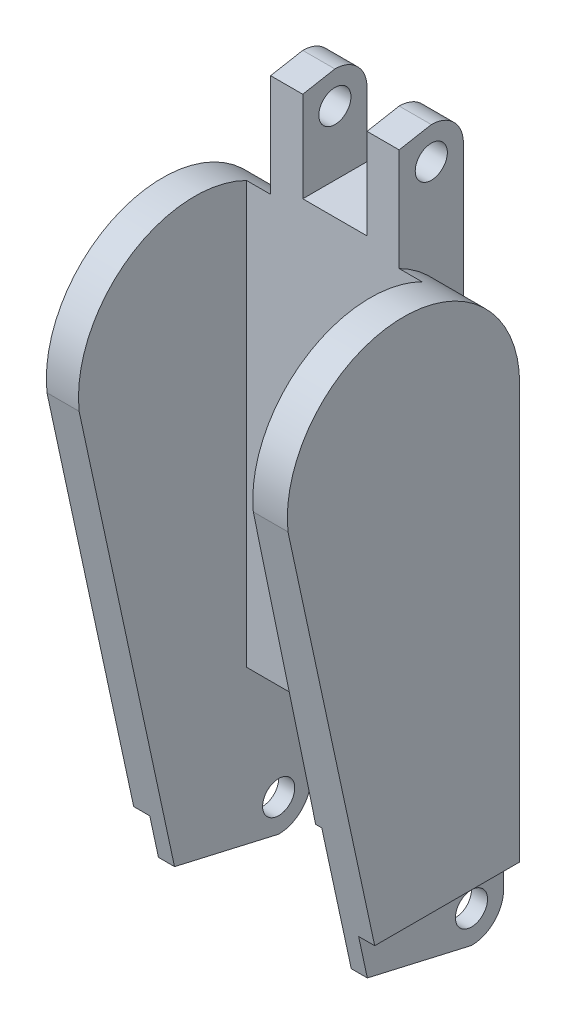
ISO-10303-21;
HEADER;
FILE_DESCRIPTION(('STEP AP214'),'2;1');
FILE_NAME('part.step','',(''),(''),'','','');
FILE_SCHEMA(('AUTOMOTIVE_DESIGN { 1 0 10303 214 1 1 1 1 }'));
ENDSEC;
DATA;
#1=APPLICATION_CONTEXT('core data for automotive mechanical design processes');
#2=APPLICATION_PROTOCOL_DEFINITION('international standard','automotive_design',2000,#1);
#3=PRODUCT_CONTEXT('',#1,'mechanical');
#4=PRODUCT('Part','Part','',(#3));
#5=PRODUCT_RELATED_PRODUCT_CATEGORY('part','',(#4));
#6=PRODUCT_DEFINITION_FORMATION('','',#4);
#7=PRODUCT_DEFINITION_CONTEXT('part definition',#1,'design');
#8=PRODUCT_DEFINITION('design','',#6,#7);
#9=PRODUCT_DEFINITION_SHAPE('','',#8);
#10=(LENGTH_UNIT() NAMED_UNIT(*) SI_UNIT(.MILLI.,.METRE.));
#11=(NAMED_UNIT(*) PLANE_ANGLE_UNIT() SI_UNIT($,.RADIAN.));
#12=(NAMED_UNIT(*) SI_UNIT($,.STERADIAN.) SOLID_ANGLE_UNIT());
#13=UNCERTAINTY_MEASURE_WITH_UNIT(LENGTH_MEASURE(1.E-05),#10,'distance_accuracy_value','');
#14=(GEOMETRIC_REPRESENTATION_CONTEXT(3) GLOBAL_UNCERTAINTY_ASSIGNED_CONTEXT((#13)) GLOBAL_UNIT_ASSIGNED_CONTEXT((#10,
#11,#12)) REPRESENTATION_CONTEXT('',''));
#15=CARTESIAN_POINT('',(0.,0.,0.));
#16=DIRECTION('',(0.,0.,1.));
#17=DIRECTION('',(1.,0.,0.));
#18=AXIS2_PLACEMENT_3D('',#15,#16,#17);
#19=CARTESIAN_POINT('',(30.,-82.,0.));
#20=DIRECTION('',(0.,0.974585748333831,-0.224014774389072));
#21=DIRECTION('',(0.,0.224014774389072,0.974585748333831));
#22=AXIS2_PLACEMENT_3D('',#19,#20,#21);
#23=PLANE('',#22);
#24=DIRECTION('',(0.,0.224014774389072,0.974585748333831));
#25=VECTOR('',#24,1.);
#26=CARTESIAN_POINT('',(2.,-82.,0.));
#27=LINE('',#26,#25);
#28=CARTESIAN_POINT('',(2.,-82.,0.));
#29=VERTEX_POINT('',#28);
#30=CARTESIAN_POINT('',(2.,-79.0206035006254,12.9619904528399));
#31=VERTEX_POINT('',#30);
#32=EDGE_CURVE('E230',#29,#31,#27,.T.);
#33=ORIENTED_EDGE('',*,*,#32,.F.);
#34=DIRECTION('',(-1.,0.,0.));
#35=VECTOR('',#34,1.);
#36=CARTESIAN_POINT('',(30.,-82.,0.));
#37=LINE('',#36,#35);
#38=CARTESIAN_POINT('',(4.,-82.,0.));
#39=VERTEX_POINT('',#38);
#40=EDGE_CURVE('E466',#39,#29,#37,.T.);
#41=ORIENTED_EDGE('',*,*,#40,.F.);
#42=DIRECTION('',(0.,-0.224014774389072,-0.974585748333831));
#43=VECTOR('',#42,1.);
#44=CARTESIAN_POINT('',(4.00000000000001,-82.,0.));
#45=LINE('',#44,#43);
#46=CARTESIAN_POINT('',(4.00000000000001,-79.0206035006254,12.9619904528399));
#47=VERTEX_POINT('',#46);
#48=EDGE_CURVE('E399',#47,#39,#45,.T.);
#49=ORIENTED_EDGE('',*,*,#48,.F.);
#50=DIRECTION('',(-1.,0.,0.));
#51=VECTOR('',#50,1.);
#52=CARTESIAN_POINT('',(70.,-79.0206035006254,12.96199045284));
#53=LINE('',#52,#51);
#54=EDGE_CURVE('E315',#47,#31,#53,.T.);
#55=ORIENTED_EDGE('',*,*,#54,.T.);
#56=EDGE_LOOP('',(#33,#41,#49,#55));
#57=FACE_BOUND('',#56,.T.);
#58=ADVANCED_FACE('F44',(#57),#23,.F.);
#59=CARTESIAN_POINT('',(30.,0.,-4.));
#60=DIRECTION('',(0.,0.,1.));
#61=DIRECTION('',(0.,-1.,0.));
#62=AXIS2_PLACEMENT_3D('',#59,#60,#61);
#63=PLANE('',#62);
#64=DIRECTION('',(0.,-1.,0.));
#65=VECTOR('',#64,1.);
#66=CARTESIAN_POINT('',(2.,0.,-4.));
#67=LINE('',#66,#65);
#68=CARTESIAN_POINT('',(2.,-74.,-4.00000000000001));
#69=VERTEX_POINT('',#68);
#70=CARTESIAN_POINT('',(2.,-78.,-4.00000000000001));
#71=VERTEX_POINT('',#70);
#72=EDGE_CURVE('E234',#69,#71,#67,.T.);
#73=ORIENTED_EDGE('',*,*,#72,.F.);
#74=DIRECTION('',(-1.,0.,0.));
#75=VECTOR('',#74,1.);
#76=CARTESIAN_POINT('',(30.,-74.,-4.00000000000001));
#77=LINE('',#76,#75);
#78=CARTESIAN_POINT('',(0.,-74.,-4.00000000000001));
#79=VERTEX_POINT('',#78);
#80=EDGE_CURVE('E222',#69,#79,#77,.T.);
#81=ORIENTED_EDGE('',*,*,#80,.T.);
#82=DIRECTION('',(0.,1.,0.));
#83=VECTOR('',#82,1.);
#84=CARTESIAN_POINT('',(0.,0.,-4.));
#85=LINE('',#84,#83);
#86=CARTESIAN_POINT('',(0.,-22.46,-4.00000000000001));
#87=VERTEX_POINT('',#86);
#88=EDGE_CURVE('E452',#79,#87,#85,.T.);
#89=ORIENTED_EDGE('',*,*,#88,.T.);
#90=DIRECTION('',(-1.,0.,0.));
#91=VECTOR('',#90,1.);
#92=CARTESIAN_POINT('',(7.,-22.46,-4.00000000000001));
#93=LINE('',#92,#91);
#94=CARTESIAN_POINT('',(7.,-22.46,-4.00000000000001));
#95=VERTEX_POINT('',#94);
#96=EDGE_CURVE('E298',#95,#87,#93,.T.);
#97=ORIENTED_EDGE('',*,*,#96,.F.);
#98=DIRECTION('',(0.,-1.,0.));
#99=VECTOR('',#98,1.);
#100=CARTESIAN_POINT('',(7.,0.,-4.));
#101=LINE('',#100,#99);
#102=CARTESIAN_POINT('',(7.,0.,-4.));
#103=VERTEX_POINT('',#102);
#104=EDGE_CURVE('E443',#103,#95,#101,.T.);
#105=ORIENTED_EDGE('',*,*,#104,.F.);
#106=DIRECTION('',(-1.,0.,0.));
#107=VECTOR('',#106,1.);
#108=CARTESIAN_POINT('',(30.,0.,-4.));
#109=LINE('',#108,#107);
#110=CARTESIAN_POINT('',(11.,0.,-4.));
#111=VERTEX_POINT('',#110);
#112=EDGE_CURVE('E456',#111,#103,#109,.T.);
#113=ORIENTED_EDGE('',*,*,#112,.F.);
#114=DIRECTION('',(0.,1.,0.));
#115=VECTOR('',#114,1.);
#116=CARTESIAN_POINT('',(11.,0.,-4.));
#117=LINE('',#116,#115);
#118=CARTESIAN_POINT('',(11.,-8.,-4.));
#119=VERTEX_POINT('',#118);
#120=EDGE_CURVE('E411',#119,#111,#117,.T.);
#121=ORIENTED_EDGE('',*,*,#120,.F.);
#122=DIRECTION('',(-1.,0.,0.));
#123=VECTOR('',#122,1.);
#124=CARTESIAN_POINT('',(30.,-8.,-4.));
#125=LINE('',#124,#123);
#126=CARTESIAN_POINT('',(19.,-8.,-4.));
#127=VERTEX_POINT('',#126);
#128=EDGE_CURVE('E487',#127,#119,#125,.T.);
#129=ORIENTED_EDGE('',*,*,#128,.F.);
#130=DIRECTION('',(0.,-1.,0.));
#131=VECTOR('',#130,1.);
#132=CARTESIAN_POINT('',(19.,0.,-4.));
#133=LINE('',#132,#131);
#134=CARTESIAN_POINT('',(19.,0.,-4.));
#135=VERTEX_POINT('',#134);
#136=EDGE_CURVE('E422',#135,#127,#133,.T.);
#137=ORIENTED_EDGE('',*,*,#136,.F.);
#138=CARTESIAN_POINT('',(23.,0.,-4.));
#139=VERTEX_POINT('',#138);
#140=EDGE_CURVE('E462',#139,#135,#109,.T.);
#141=ORIENTED_EDGE('',*,*,#140,.F.);
#142=DIRECTION('',(0.,1.,0.));
#143=VECTOR('',#142,1.);
#144=CARTESIAN_POINT('',(23.,0.,-4.));
#145=LINE('',#144,#143);
#146=CARTESIAN_POINT('',(23.,-22.46,-4.00000000000001));
#147=VERTEX_POINT('',#146);
#148=EDGE_CURVE('E432',#147,#139,#145,.T.);
#149=ORIENTED_EDGE('',*,*,#148,.F.);
#150=DIRECTION('',(1.,0.,0.));
#151=VECTOR('',#150,1.);
#152=CARTESIAN_POINT('',(23.,-22.46,-4.00000000000001));
#153=LINE('',#152,#151);
#154=CARTESIAN_POINT('',(30.,-22.46,-4.00000000000001));
#155=VERTEX_POINT('',#154);
#156=EDGE_CURVE('E279',#147,#155,#153,.T.);
#157=ORIENTED_EDGE('',*,*,#156,.T.);
#158=DIRECTION('',(0.,1.,0.));
#159=VECTOR('',#158,1.);
#160=CARTESIAN_POINT('',(30.,0.,-4.));
#161=LINE('',#160,#159);
#162=CARTESIAN_POINT('',(30.,-74.,-4.00000000000001));
#163=VERTEX_POINT('',#162);
#164=EDGE_CURVE('E453',#163,#155,#161,.T.);
#165=ORIENTED_EDGE('',*,*,#164,.F.);
#166=DIRECTION('',(-1.,0.,0.));
#167=VECTOR('',#166,1.);
#168=CARTESIAN_POINT('',(30.,-74.,-4.00000000000001));
#169=LINE('',#168,#167);
#170=CARTESIAN_POINT('',(28.,-74.,-4.00000000000001));
#171=VERTEX_POINT('',#170);
#172=EDGE_CURVE('E11',#163,#171,#169,.T.);
#173=ORIENTED_EDGE('',*,*,#172,.T.);
#174=DIRECTION('',(0.,-1.,0.));
#175=VECTOR('',#174,1.);
#176=CARTESIAN_POINT('',(28.,0.,-4.));
#177=LINE('',#176,#175);
#178=CARTESIAN_POINT('',(28.,-78.,-4.00000000000001));
#179=VERTEX_POINT('',#178);
#180=EDGE_CURVE('E260',#171,#179,#177,.T.);
#181=ORIENTED_EDGE('',*,*,#180,.T.);
#182=DIRECTION('',(-1.,0.,0.));
#183=VECTOR('',#182,1.);
#184=CARTESIAN_POINT('',(30.,-78.,-4.00000000000001));
#185=LINE('',#184,#183);
#186=CARTESIAN_POINT('',(26.,-78.,-4.00000000000001));
#187=VERTEX_POINT('',#186);
#188=EDGE_CURVE('E463',#179,#187,#185,.T.);
#189=ORIENTED_EDGE('',*,*,#188,.T.);
#190=DIRECTION('',(0.,-1.,0.));
#191=VECTOR('',#190,1.);
#192=CARTESIAN_POINT('',(26.,0.,-4.));
#193=LINE('',#192,#191);
#194=CARTESIAN_POINT('',(26.,-62.,-4.00000000000001));
#195=VERTEX_POINT('',#194);
#196=EDGE_CURVE('E364',#195,#187,#193,.T.);
#197=ORIENTED_EDGE('',*,*,#196,.F.);
#198=DIRECTION('',(1.,0.,0.));
#199=VECTOR('',#198,1.);
#200=CARTESIAN_POINT('',(30.,-62.,-4.00000000000001));
#201=LINE('',#200,#199);
#202=CARTESIAN_POINT('',(4.,-62.,-4.00000000000001));
#203=VERTEX_POINT('',#202);
#204=EDGE_CURVE('E346',#203,#195,#201,.T.);
#205=ORIENTED_EDGE('',*,*,#204,.F.);
#206=DIRECTION('',(0.,1.,0.));
#207=VECTOR('',#206,1.);
#208=CARTESIAN_POINT('',(4.,0.,-4.));
#209=LINE('',#208,#207);
#210=CARTESIAN_POINT('',(4.,-78.,-4.00000000000001));
#211=VERTEX_POINT('',#210);
#212=EDGE_CURVE('E352',#211,#203,#209,.T.);
#213=ORIENTED_EDGE('',*,*,#212,.F.);
#214=EDGE_CURVE('E244',#211,#71,#185,.T.);
#215=ORIENTED_EDGE('',*,*,#214,.T.);
#216=EDGE_LOOP('',(#73,#81,#89,#97,#105,#113,#121,#129,#137,#141,#149,#157,#165,#173,#181,#189,
#197,#205,#213,#215));
#217=FACE_BOUND('',#216,.T.);
#218=ADVANCED_FACE('F241',(#217),#63,.F.);
#219=CARTESIAN_POINT('',(30.,-78.,0.));
#220=DIRECTION('',(-1.,0.,0.));
#221=DIRECTION('',(0.,0.,1.));
#222=AXIS2_PLACEMENT_3D('',#219,#220,#221);
#223=CYLINDRICAL_SURFACE('',#222,4.00000000000001);
#224=CARTESIAN_POINT('',(2.,-78.,0.));
#225=DIRECTION('',(-1.,0.,0.));
#226=DIRECTION('',(0.,0.,1.));
#227=AXIS2_PLACEMENT_3D('',#224,#225,#226);
#228=CIRCLE('',#227,4.00000000000001);
#229=EDGE_CURVE('E247',#71,#29,#228,.T.);
#230=ORIENTED_EDGE('',*,*,#229,.F.);
#231=ORIENTED_EDGE('',*,*,#214,.F.);
#232=CARTESIAN_POINT('',(4.,-78.,0.));
#233=DIRECTION('',(1.,0.,0.));
#234=DIRECTION('',(0.,0.,-1.));
#235=AXIS2_PLACEMENT_3D('',#232,#233,#234);
#236=CIRCLE('',#235,4.00000000000001);
#237=EDGE_CURVE('E349',#39,#211,#236,.T.);
#238=ORIENTED_EDGE('',*,*,#237,.F.);
#239=ORIENTED_EDGE('',*,*,#40,.T.);
#240=EDGE_LOOP('',(#230,#231,#238,#239));
#241=FACE_BOUND('',#240,.T.);
#242=ADVANCED_FACE('F558',(#241),#223,.T.);
#243=CARTESIAN_POINT('',(30.,-78.,0.));
#244=DIRECTION('',(-1.,0.,0.));
#245=DIRECTION('',(0.,0.,1.));
#246=AXIS2_PLACEMENT_3D('',#243,#244,#245);
#247=CYLINDRICAL_SURFACE('',#246,2.);
#248=CARTESIAN_POINT('',(4.,-78.,0.));
#249=DIRECTION('',(1.,0.,0.));
#250=DIRECTION('',(0.,0.,-1.));
#251=AXIS2_PLACEMENT_3D('',#248,#249,#250);
#252=CIRCLE('',#251,2.);
#253=CARTESIAN_POINT('',(4.,-78.,-2.));
#254=VERTEX_POINT('',#253);
#255=EDGE_CURVE('E355',#254,#254,#252,.T.);
#256=ORIENTED_EDGE('',*,*,#255,.T.);
#257=EDGE_LOOP('',(#256));
#258=FACE_BOUND('',#257,.T.);
#259=CARTESIAN_POINT('',(2.,-78.,0.));
#260=DIRECTION('',(-1.,0.,0.));
#261=DIRECTION('',(0.,0.,1.));
#262=AXIS2_PLACEMENT_3D('',#259,#260,#261);
#263=CIRCLE('',#262,2.);
#264=CARTESIAN_POINT('',(2.,-78.,2.));
#265=VERTEX_POINT('',#264);
#266=EDGE_CURVE('E246',#265,#265,#263,.T.);
#267=ORIENTED_EDGE('',*,*,#266,.T.);
#268=EDGE_LOOP('',(#267));
#269=FACE_BOUND('',#268,.T.);
#270=ADVANCED_FACE('F527',(#258,#269),#247,.F.);
#271=CARTESIAN_POINT('',(70.,-8.,28.29));
#272=DIRECTION('',(0.,0.210967285206574,-0.977493122519319));
#273=DIRECTION('',(0.,0.977493122519319,0.210967285206574));
#274=AXIS2_PLACEMENT_3D('',#271,#272,#273);
#275=PLANE('',#274);
#276=DIRECTION('',(0.,0.977493122519319,0.210967285206574));
#277=VECTOR('',#276,1.);
#278=CARTESIAN_POINT('',(2.,-8.,28.29));
#279=LINE('',#278,#277);
#280=CARTESIAN_POINT('',(2.,-74.,14.0455613406797));
#281=VERTEX_POINT('',#280);
#282=EDGE_CURVE('E53',#31,#281,#279,.T.);
#283=ORIENTED_EDGE('',*,*,#282,.F.);
#284=ORIENTED_EDGE('',*,*,#54,.F.);
#285=DIRECTION('',(0.,0.977493122519319,0.210967285206574));
#286=VECTOR('',#285,1.);
#287=CARTESIAN_POINT('',(4.00000000000001,-1.60359886134908,29.6705021766654));
#288=LINE('',#287,#286);
#289=CARTESIAN_POINT('',(4.,-23.9912142701637,24.838698927888));
#290=VERTEX_POINT('',#289);
#291=EDGE_CURVE('E327',#47,#290,#288,.T.);
#292=ORIENTED_EDGE('',*,*,#291,.T.);
#293=DIRECTION('',(-1.,0.,0.));
#294=VECTOR('',#293,1.);
#295=CARTESIAN_POINT('',(7.,-23.9912142701637,24.838698927888));
#296=LINE('',#295,#294);
#297=CARTESIAN_POINT('',(0.,-23.9912142701637,24.838698927888));
#298=VERTEX_POINT('',#297);
#299=EDGE_CURVE('E503',#290,#298,#296,.T.);
#300=ORIENTED_EDGE('',*,*,#299,.T.);
#301=DIRECTION('',(0.,-0.977493122519319,-0.210967285206574));
#302=VECTOR('',#301,1.);
#303=CARTESIAN_POINT('',(0.,-8.,28.29));
#304=LINE('',#303,#302);
#305=CARTESIAN_POINT('',(0.,-74.,14.0455613406797));
#306=VERTEX_POINT('',#305);
#307=EDGE_CURVE('E311',#298,#306,#304,.T.);
#308=ORIENTED_EDGE('',*,*,#307,.T.);
#309=DIRECTION('',(1.,0.,0.));
#310=VECTOR('',#309,1.);
#311=CARTESIAN_POINT('',(70.,-74.,14.0455613406797));
#312=LINE('',#311,#310);
#313=EDGE_CURVE('E511',#306,#281,#312,.T.);
#314=ORIENTED_EDGE('',*,*,#313,.T.);
#315=EDGE_LOOP('',(#283,#284,#292,#300,#308,#314));
#316=FACE_BOUND('',#315,.T.);
#317=ADVANCED_FACE('F599',(#316),#275,.F.);
#318=CARTESIAN_POINT('',(26.,3.93673286000634,4.));
#319=DIRECTION('',(-0.999933955759206,0.0114927855520723,0.));
#320=DIRECTION('',(-0.0114927855520723,-0.999933955759206,0.));
#321=AXIS2_PLACEMENT_3D('',#318,#319,#320);
#322=PLANE('',#321);
#323=DIRECTION('',(-0.0112341518568577,-0.977431437742416,-0.210953972100198));
#324=VECTOR('',#323,1.);
#325=CARTESIAN_POINT('',(25.9363299866333,-1.6028996373134,29.6706530865728));
#326=LINE('',#325,#324);
#327=CARTESIAN_POINT('',(25.6790088931094,-23.9912142701637,24.838698927888));
#328=VERTEX_POINT('',#327);
#329=CARTESIAN_POINT('',(25.2421532178203,-62.,16.635459278738));
#330=VERTEX_POINT('',#329);
#331=EDGE_CURVE('E324',#328,#330,#326,.T.);
#332=ORIENTED_EDGE('',*,*,#331,.F.);
#333=CARTESIAN_POINT('',(25.6966079726685,-22.46,10.46));
#334=DIRECTION('',(-0.999933955759206,0.0114927855520723,0.));
#335=DIRECTION('',(0.0114927855520723,0.999933955759206,0.));
#336=AXIS2_PLACEMENT_3D('',#333,#334,#335);
#337=ELLIPSE('',#336,14.4609550627983,14.46);
#338=CARTESIAN_POINT('',(25.8452973080792,-9.52323069696302,4.));
#339=VERTEX_POINT('',#338);
#340=EDGE_CURVE('E286',#328,#339,#337,.T.);
#341=ORIENTED_EDGE('',*,*,#340,.T.);
#342=DIRECTION('',(-0.0114927855520723,-0.999933955759206,0.));
#343=VECTOR('',#342,1.);
#344=CARTESIAN_POINT('',(26.,3.93673286000634,4.));
#345=LINE('',#344,#343);
#346=CARTESIAN_POINT('',(25.2421532178203,-62.,4.));
#347=VERTEX_POINT('',#346);
#348=EDGE_CURVE('E372',#339,#347,#345,.T.);
#349=ORIENTED_EDGE('',*,*,#348,.T.);
#350=DIRECTION('',(0.,0.,1.));
#351=VECTOR('',#350,1.);
#352=CARTESIAN_POINT('',(25.2421532178203,-62.,4.));
#353=LINE('',#352,#351);
#354=EDGE_CURVE('E342',#347,#330,#353,.T.);
#355=ORIENTED_EDGE('',*,*,#354,.T.);
#356=EDGE_LOOP('',(#332,#341,#349,#355));
#357=FACE_BOUND('',#356,.T.);
#358=ADVANCED_FACE('F663',(#357),#322,.T.);
#359=CARTESIAN_POINT('',(0.,0.,4.));
#360=DIRECTION('',(0.,0.,-1.));
#361=DIRECTION('',(-1.,0.,0.));
#362=AXIS2_PLACEMENT_3D('',#359,#360,#361);
#363=PLANE('',#362);
#364=DIRECTION('',(1.,0.,0.));
#365=VECTOR('',#364,1.);
#366=CARTESIAN_POINT('',(23.,-9.52323069696301,4.));
#367=LINE('',#366,#365);
#368=CARTESIAN_POINT('',(23.,-9.52323069696301,4.));
#369=VERTEX_POINT('',#368);
#370=EDGE_CURVE('E290',#369,#339,#367,.T.);
#371=ORIENTED_EDGE('',*,*,#370,.F.);
#372=DIRECTION('',(0.,1.,0.));
#373=VECTOR('',#372,1.);
#374=CARTESIAN_POINT('',(23.,4.,4.));
#375=LINE('',#374,#373);
#376=CARTESIAN_POINT('',(23.,3.27210884353742,4.));
#377=VERTEX_POINT('',#376);
#378=EDGE_CURVE('E396',#369,#377,#375,.T.);
#379=ORIENTED_EDGE('',*,*,#378,.T.);
#380=DIRECTION('',(1.,0.,0.));
#381=VECTOR('',#380,1.);
#382=CARTESIAN_POINT('',(30.,3.27210884353742,4.));
#383=LINE('',#382,#381);
#384=CARTESIAN_POINT('',(19.,3.27210884353741,4.));
#385=VERTEX_POINT('',#384);
#386=EDGE_CURVE('E392',#385,#377,#383,.T.);
#387=ORIENTED_EDGE('',*,*,#386,.F.);
#388=DIRECTION('',(0.,-1.,0.));
#389=VECTOR('',#388,1.);
#390=CARTESIAN_POINT('',(19.,4.,4.));
#391=LINE('',#390,#389);
#392=CARTESIAN_POINT('',(19.,-8.,4.));
#393=VERTEX_POINT('',#392);
#394=EDGE_CURVE('E389',#385,#393,#391,.T.);
#395=ORIENTED_EDGE('',*,*,#394,.T.);
#396=DIRECTION('',(-1.,0.,0.));
#397=VECTOR('',#396,1.);
#398=CARTESIAN_POINT('',(19.,-8.,4.));
#399=LINE('',#398,#397);
#400=CARTESIAN_POINT('',(11.,-8.,4.));
#401=VERTEX_POINT('',#400);
#402=EDGE_CURVE('E386',#393,#401,#399,.T.);
#403=ORIENTED_EDGE('',*,*,#402,.T.);
#404=DIRECTION('',(0.,1.,0.));
#405=VECTOR('',#404,1.);
#406=CARTESIAN_POINT('',(11.,4.,4.));
#407=LINE('',#406,#405);
#408=CARTESIAN_POINT('',(11.,3.27210884353742,4.));
#409=VERTEX_POINT('',#408);
#410=EDGE_CURVE('E383',#401,#409,#407,.T.);
#411=ORIENTED_EDGE('',*,*,#410,.T.);
#412=DIRECTION('',(1.,0.,0.));
#413=VECTOR('',#412,1.);
#414=CARTESIAN_POINT('',(30.,3.27210884353742,4.));
#415=LINE('',#414,#413);
#416=CARTESIAN_POINT('',(7.,3.27210884353741,4.));
#417=VERTEX_POINT('',#416);
#418=EDGE_CURVE('E379',#417,#409,#415,.T.);
#419=ORIENTED_EDGE('',*,*,#418,.F.);
#420=DIRECTION('',(0.,-1.,0.));
#421=VECTOR('',#420,1.);
#422=CARTESIAN_POINT('',(7.,4.,4.));
#423=LINE('',#422,#421);
#424=CARTESIAN_POINT('',(7.,-9.52323069696301,4.));
#425=VERTEX_POINT('',#424);
#426=EDGE_CURVE('E491',#417,#425,#423,.T.);
#427=ORIENTED_EDGE('',*,*,#426,.T.);
#428=DIRECTION('',(-1.,0.,0.));
#429=VECTOR('',#428,1.);
#430=CARTESIAN_POINT('',(7.,-9.52323069696301,4.));
#431=LINE('',#430,#429);
#432=CARTESIAN_POINT('',(4.00000000000001,-9.52323069696301,4.));
#433=VERTEX_POINT('',#432);
#434=EDGE_CURVE('E307',#425,#433,#431,.T.);
#435=ORIENTED_EDGE('',*,*,#434,.T.);
#436=DIRECTION('',(0.,1.,0.));
#437=VECTOR('',#436,1.);
#438=CARTESIAN_POINT('',(4.00000000000001,3.93673286000634,4.));
#439=LINE('',#438,#437);
#440=CARTESIAN_POINT('',(4.,-62.,4.));
#441=VERTEX_POINT('',#440);
#442=EDGE_CURVE('E375',#441,#433,#439,.T.);
#443=ORIENTED_EDGE('',*,*,#442,.F.);
#444=DIRECTION('',(-1.,0.,0.));
#445=VECTOR('',#444,1.);
#446=CARTESIAN_POINT('',(0.,-62.,4.));
#447=LINE('',#446,#445);
#448=EDGE_CURVE('E494',#347,#441,#447,.T.);
#449=ORIENTED_EDGE('',*,*,#448,.F.);
#450=ORIENTED_EDGE('',*,*,#348,.F.);
#451=EDGE_LOOP('',(#371,#379,#387,#395,#403,#411,#419,#427,#435,#443,#449,#450));
#452=FACE_BOUND('',#451,.T.);
#453=ADVANCED_FACE('F631',(#452),#363,.F.);
#454=CARTESIAN_POINT('',(30.,0.,0.));
#455=DIRECTION('',(1.,0.,0.));
#456=DIRECTION('',(0.,0.,-1.));
#457=AXIS2_PLACEMENT_3D('',#454,#455,#456);
#458=PLANE('',#457);
#459=DIRECTION('',(0.,0.,-1.));
#460=VECTOR('',#459,1.);
#461=CARTESIAN_POINT('',(30.,-74.,17.));
#462=LINE('',#461,#460);
#463=CARTESIAN_POINT('',(30.,-74.,14.0455613406797));
#464=VERTEX_POINT('',#463);
#465=EDGE_CURVE('E590',#464,#163,#462,.T.);
#466=ORIENTED_EDGE('',*,*,#465,.T.);
#467=ORIENTED_EDGE('',*,*,#164,.T.);
#468=CARTESIAN_POINT('',(30.,-22.46,10.46));
#469=DIRECTION('',(1.,0.,0.));
#470=DIRECTION('',(0.,0.,1.));
#471=AXIS2_PLACEMENT_3D('',#468,#469,#470);
#472=CIRCLE('',#471,14.46);
#473=CARTESIAN_POINT('',(30.,-23.9912142701637,24.838698927888));
#474=VERTEX_POINT('',#473);
#475=EDGE_CURVE('E274',#155,#474,#472,.T.);
#476=ORIENTED_EDGE('',*,*,#475,.T.);
#477=DIRECTION('',(0.,0.977493122519319,0.210967285206574));
#478=VECTOR('',#477,1.);
#479=CARTESIAN_POINT('',(30.,-6.18999506407352,28.6806440042859));
#480=LINE('',#479,#478);
#481=EDGE_CURVE('E331',#464,#474,#480,.T.);
#482=ORIENTED_EDGE('',*,*,#481,.F.);
#483=EDGE_LOOP('',(#466,#467,#476,#482));
#484=FACE_BOUND('',#483,.T.);
#485=ADVANCED_FACE('F671',(#484),#458,.T.);
#486=DIRECTION('',(0.,0.977493122519319,0.210967285206574));
#487=VECTOR('',#486,1.);
#488=CARTESIAN_POINT('',(28.,-8.,28.29));
#489=LINE('',#488,#487);
#490=CARTESIAN_POINT('',(28.,-79.0206035006254,12.96199045284));
#491=VERTEX_POINT('',#490);
#492=CARTESIAN_POINT('',(28.,-74.,14.0455613406797));
#493=VERTEX_POINT('',#492);
#494=EDGE_CURVE('E266',#491,#493,#489,.T.);
#495=ORIENTED_EDGE('',*,*,#494,.T.);
#496=DIRECTION('',(1.,0.,0.));
#497=VECTOR('',#496,1.);
#498=CARTESIAN_POINT('',(70.,-74.,14.0455613406797));
#499=LINE('',#498,#497);
#500=EDGE_CURVE('E270',#493,#464,#499,.T.);
#501=ORIENTED_EDGE('',*,*,#500,.T.);
#502=ORIENTED_EDGE('',*,*,#481,.T.);
#503=DIRECTION('',(1.,0.,0.));
#504=VECTOR('',#503,1.);
#505=CARTESIAN_POINT('',(23.,-23.9912142701637,24.838698927888));
#506=LINE('',#505,#504);
#507=EDGE_CURVE('E507',#328,#474,#506,.T.);
#508=ORIENTED_EDGE('',*,*,#507,.F.);
#509=ORIENTED_EDGE('',*,*,#331,.T.);
#510=DIRECTION('',(1.,0.,0.));
#511=VECTOR('',#510,1.);
#512=CARTESIAN_POINT('',(15.,-62.,16.635459278738));
#513=LINE('',#512,#511);
#514=CARTESIAN_POINT('',(26.,-62.,16.635459278738));
#515=VERTEX_POINT('',#514);
#516=EDGE_CURVE('E497',#330,#515,#513,.T.);
#517=ORIENTED_EDGE('',*,*,#516,.T.);
#518=DIRECTION('',(0.,-0.977493122519319,-0.210967285206574));
#519=VECTOR('',#518,1.);
#520=CARTESIAN_POINT('',(26.,-70.3798066363567,14.8268889513357));
#521=LINE('',#520,#519);
#522=CARTESIAN_POINT('',(26.,-79.0206035006254,12.96199045284));
#523=VERTEX_POINT('',#522);
#524=EDGE_CURVE('E320',#515,#523,#521,.T.);
#525=ORIENTED_EDGE('',*,*,#524,.T.);
#526=EDGE_CURVE('E319',#491,#523,#53,.T.);
#527=ORIENTED_EDGE('',*,*,#526,.F.);
#528=EDGE_LOOP('',(#495,#501,#502,#508,#509,#517,#525,#527));
#529=FACE_BOUND('',#528,.T.);
#530=ADVANCED_FACE('F571',(#529),#275,.F.);
#531=CARTESIAN_POINT('',(4.00000000000001,3.93673286000634,4.));
#532=DIRECTION('',(1.,0.,0.));
#533=DIRECTION('',(0.,0.,-1.));
#534=AXIS2_PLACEMENT_3D('',#531,#532,#533);
#535=PLANE('',#534);
#536=ORIENTED_EDGE('',*,*,#255,.F.);
#537=EDGE_LOOP('',(#536));
#538=FACE_BOUND('',#537,.T.);
#539=CARTESIAN_POINT('',(4.00000000000001,-22.46,10.46));
#540=DIRECTION('',(1.,0.,0.));
#541=DIRECTION('',(0.,0.,-1.));
#542=AXIS2_PLACEMENT_3D('',#539,#540,#541);
#543=CIRCLE('',#542,14.46);
#544=EDGE_CURVE('E304',#290,#433,#543,.F.);
#545=ORIENTED_EDGE('',*,*,#544,.F.);
#546=ORIENTED_EDGE('',*,*,#291,.F.);
#547=ORIENTED_EDGE('',*,*,#48,.T.);
#548=ORIENTED_EDGE('',*,*,#237,.T.);
#549=ORIENTED_EDGE('',*,*,#212,.T.);
#550=DIRECTION('',(0.,0.,1.));
#551=VECTOR('',#550,1.);
#552=CARTESIAN_POINT('',(4.,-62.,-24.));
#553=LINE('',#552,#551);
#554=EDGE_CURVE('E338',#203,#441,#553,.T.);
#555=ORIENTED_EDGE('',*,*,#554,.T.);
#556=ORIENTED_EDGE('',*,*,#442,.T.);
#557=EDGE_LOOP('',(#545,#546,#547,#548,#549,#555,#556));
#558=FACE_BOUND('',#557,.T.);
#559=ADVANCED_FACE('F563',(#538,#558),#535,.T.);
#560=CARTESIAN_POINT('',(28.,-82.,0.));
#561=VERTEX_POINT('',#560);
#562=CARTESIAN_POINT('',(26.,-82.,0.));
#563=VERTEX_POINT('',#562);
#564=EDGE_CURVE('E467',#561,#563,#37,.T.);
#565=ORIENTED_EDGE('',*,*,#564,.F.);
#566=DIRECTION('',(0.,0.224014774389072,0.974585748333831));
#567=VECTOR('',#566,1.);
#568=CARTESIAN_POINT('',(28.,-82.,0.));
#569=LINE('',#568,#567);
#570=EDGE_CURVE('E60',#561,#491,#569,.T.);
#571=ORIENTED_EDGE('',*,*,#570,.T.);
#572=ORIENTED_EDGE('',*,*,#526,.T.);
#573=DIRECTION('',(0.,0.224014774389072,0.974585748333831));
#574=VECTOR('',#573,1.);
#575=CARTESIAN_POINT('',(26.,-82.,0.));
#576=LINE('',#575,#574);
#577=EDGE_CURVE('E368',#563,#523,#576,.T.);
#578=ORIENTED_EDGE('',*,*,#577,.F.);
#579=EDGE_LOOP('',(#565,#571,#572,#578));
#580=FACE_BOUND('',#579,.T.);
#581=ADVANCED_FACE('F553',(#580),#23,.F.);
#582=ORIENTED_EDGE('',*,*,#188,.F.);
#583=CARTESIAN_POINT('',(28.,-78.,0.));
#584=DIRECTION('',(-1.,0.,0.));
#585=DIRECTION('',(0.,0.,1.));
#586=AXIS2_PLACEMENT_3D('',#583,#584,#585);
#587=CIRCLE('',#586,4.00000000000001);
#588=EDGE_CURVE('E257',#179,#561,#587,.T.);
#589=ORIENTED_EDGE('',*,*,#588,.T.);
#590=ORIENTED_EDGE('',*,*,#564,.T.);
#591=CARTESIAN_POINT('',(26.,-78.,0.));
#592=DIRECTION('',(-1.,0.,0.));
#593=DIRECTION('',(0.,0.,1.));
#594=AXIS2_PLACEMENT_3D('',#591,#592,#593);
#595=CIRCLE('',#594,4.00000000000001);
#596=EDGE_CURVE('E360',#187,#563,#595,.T.);
#597=ORIENTED_EDGE('',*,*,#596,.F.);
#598=EDGE_LOOP('',(#582,#589,#590,#597));
#599=FACE_BOUND('',#598,.T.);
#600=ADVANCED_FACE('F525',(#599),#223,.T.);
#601=CARTESIAN_POINT('',(28.,-78.,0.));
#602=DIRECTION('',(-1.,0.,0.));
#603=DIRECTION('',(0.,0.,1.));
#604=AXIS2_PLACEMENT_3D('',#601,#602,#603);
#605=CIRCLE('',#604,2.);
#606=CARTESIAN_POINT('',(28.,-78.,2.));
#607=VERTEX_POINT('',#606);
#608=EDGE_CURVE('E252',#607,#607,#605,.T.);
#609=ORIENTED_EDGE('',*,*,#608,.F.);
#610=EDGE_LOOP('',(#609));
#611=FACE_BOUND('',#610,.T.);
#612=CARTESIAN_POINT('',(26.,-78.,0.));
#613=DIRECTION('',(-1.,0.,0.));
#614=DIRECTION('',(0.,0.,1.));
#615=AXIS2_PLACEMENT_3D('',#612,#613,#614);
#616=CIRCLE('',#615,2.);
#617=CARTESIAN_POINT('',(26.,-78.,2.));
#618=VERTEX_POINT('',#617);
#619=EDGE_CURVE('E359',#618,#618,#616,.T.);
#620=ORIENTED_EDGE('',*,*,#619,.T.);
#621=EDGE_LOOP('',(#620));
#622=FACE_BOUND('',#621,.T.);
#623=ADVANCED_FACE('F521',(#611,#622),#247,.F.);
#624=CARTESIAN_POINT('',(0.,0.,0.));
#625=DIRECTION('',(1.,0.,0.));
#626=DIRECTION('',(0.,0.,-1.));
#627=AXIS2_PLACEMENT_3D('',#624,#625,#626);
#628=PLANE('',#627);
#629=ORIENTED_EDGE('',*,*,#88,.F.);
#630=DIRECTION('',(0.,0.,-1.));
#631=VECTOR('',#630,1.);
#632=CARTESIAN_POINT('',(0.,-74.,17.));
#633=LINE('',#632,#631);
#634=EDGE_CURVE('E225',#306,#79,#633,.T.);
#635=ORIENTED_EDGE('',*,*,#634,.F.);
#636=ORIENTED_EDGE('',*,*,#307,.F.);
#637=CARTESIAN_POINT('',(0.,-22.46,10.46));
#638=DIRECTION('',(1.,0.,0.));
#639=DIRECTION('',(0.,0.,1.));
#640=AXIS2_PLACEMENT_3D('',#637,#638,#639);
#641=CIRCLE('',#640,14.46);
#642=EDGE_CURVE('E293',#87,#298,#641,.T.);
#643=ORIENTED_EDGE('',*,*,#642,.F.);
#644=EDGE_LOOP('',(#629,#635,#636,#643));
#645=FACE_BOUND('',#644,.T.);
#646=ADVANCED_FACE('F524',(#645),#628,.F.);
#647=CARTESIAN_POINT('',(30.,0.,0.));
#648=DIRECTION('',(-1.,0.,0.));
#649=DIRECTION('',(0.,0.,1.));
#650=AXIS2_PLACEMENT_3D('',#647,#648,#649);
#651=CYLINDRICAL_SURFACE('',#650,4.);
#652=CARTESIAN_POINT('',(7.,0.,0.));
#653=DIRECTION('',(-1.,0.,0.));
#654=DIRECTION('',(0.,0.,1.));
#655=AXIS2_PLACEMENT_3D('',#652,#653,#654);
#656=CIRCLE('',#655,4.);
#657=CARTESIAN_POINT('',(7.,4.00000000000004,-3.98986399474666E-13));
#658=VERTEX_POINT('',#657);
#659=EDGE_CURVE('E446',#658,#103,#656,.T.);
#660=ORIENTED_EDGE('',*,*,#659,.F.);
#661=DIRECTION('',(-1.,0.,0.));
#662=VECTOR('',#661,1.);
#663=CARTESIAN_POINT('',(30.,4.,0.));
#664=LINE('',#663,#662);
#665=CARTESIAN_POINT('',(11.,4.,0.));
#666=VERTEX_POINT('',#665);
#667=EDGE_CURVE('E470',#666,#658,#664,.T.);
#668=ORIENTED_EDGE('',*,*,#667,.F.);
#669=CARTESIAN_POINT('',(11.,0.,0.));
#670=DIRECTION('',(1.,0.,0.));
#671=DIRECTION('',(0.,0.,-1.));
#672=AXIS2_PLACEMENT_3D('',#669,#670,#671);
#673=CIRCLE('',#672,4.);
#674=EDGE_CURVE('E414',#111,#666,#673,.T.);
#675=ORIENTED_EDGE('',*,*,#674,.F.);
#676=ORIENTED_EDGE('',*,*,#112,.T.);
#677=EDGE_LOOP('',(#660,#668,#675,#676));
#678=FACE_BOUND('',#677,.T.);
#679=ADVANCED_FACE('F46',(#678),#651,.T.);
#680=CARTESIAN_POINT('',(23.,0.,0.));
#681=DIRECTION('',(1.,0.,0.));
#682=DIRECTION('',(0.,0.,-1.));
#683=AXIS2_PLACEMENT_3D('',#680,#681,#682);
#684=CIRCLE('',#683,4.);
#685=CARTESIAN_POINT('',(23.,4.,0.));
#686=VERTEX_POINT('',#685);
#687=EDGE_CURVE('E435',#139,#686,#684,.T.);
#688=ORIENTED_EDGE('',*,*,#687,.F.);
#689=ORIENTED_EDGE('',*,*,#140,.T.);
#690=CARTESIAN_POINT('',(19.,0.,0.));
#691=DIRECTION('',(-1.,0.,0.));
#692=DIRECTION('',(0.,0.,1.));
#693=AXIS2_PLACEMENT_3D('',#690,#691,#692);
#694=CIRCLE('',#693,4.);
#695=CARTESIAN_POINT('',(19.,4.,0.));
#696=VERTEX_POINT('',#695);
#697=EDGE_CURVE('E425',#696,#135,#694,.T.);
#698=ORIENTED_EDGE('',*,*,#697,.F.);
#699=EDGE_CURVE('E474',#686,#696,#664,.T.);
#700=ORIENTED_EDGE('',*,*,#699,.F.);
#701=EDGE_LOOP('',(#688,#689,#698,#700));
#702=FACE_BOUND('',#701,.T.);
#703=ADVANCED_FACE('F613',(#702),#651,.T.);
#704=CARTESIAN_POINT('',(30.,-1.35,29.4));
#705=DIRECTION('',(0.,-0.983843127840538,-0.179032678025404));
#706=DIRECTION('',(0.,0.179032678025404,-0.983843127840538));
#707=AXIS2_PLACEMENT_3D('',#704,#705,#706);
#708=PLANE('',#707);
#709=DIRECTION('',(0.,0.179032678025404,-0.983843127840538));
#710=VECTOR('',#709,1.);
#711=CARTESIAN_POINT('',(7.,-1.35,29.4));
#712=LINE('',#711,#710);
#713=EDGE_CURVE('E449',#417,#658,#712,.T.);
#714=ORIENTED_EDGE('',*,*,#713,.F.);
#715=ORIENTED_EDGE('',*,*,#418,.T.);
#716=DIRECTION('',(0.,-0.179032678025404,0.983843127840538));
#717=VECTOR('',#716,1.);
#718=CARTESIAN_POINT('',(11.,-1.35,29.4));
#719=LINE('',#718,#717);
#720=EDGE_CURVE('E417',#666,#409,#719,.T.);
#721=ORIENTED_EDGE('',*,*,#720,.F.);
#722=ORIENTED_EDGE('',*,*,#667,.T.);
#723=EDGE_LOOP('',(#714,#715,#721,#722));
#724=FACE_BOUND('',#723,.T.);
#725=ADVANCED_FACE('F640',(#724),#708,.F.);
#726=DIRECTION('',(0.,0.179032678025404,-0.983843127840538));
#727=VECTOR('',#726,1.);
#728=CARTESIAN_POINT('',(19.,-1.35,29.4));
#729=LINE('',#728,#727);
#730=EDGE_CURVE('E428',#385,#696,#729,.T.);
#731=ORIENTED_EDGE('',*,*,#730,.F.);
#732=ORIENTED_EDGE('',*,*,#386,.T.);
#733=DIRECTION('',(0.,-0.179032678025404,0.983843127840538));
#734=VECTOR('',#733,1.);
#735=CARTESIAN_POINT('',(23.,-1.35,29.4));
#736=LINE('',#735,#734);
#737=EDGE_CURVE('E438',#686,#377,#736,.T.);
#738=ORIENTED_EDGE('',*,*,#737,.F.);
#739=ORIENTED_EDGE('',*,*,#699,.T.);
#740=EDGE_LOOP('',(#731,#732,#738,#739));
#741=FACE_BOUND('',#740,.T.);
#742=ADVANCED_FACE('F679',(#741),#708,.F.);
#743=CARTESIAN_POINT('',(19.,-8.,-14.));
#744=DIRECTION('',(0.,1.,0.));
#745=DIRECTION('',(0.,0.,1.));
#746=AXIS2_PLACEMENT_3D('',#743,#744,#745);
#747=PLANE('',#746);
#748=ORIENTED_EDGE('',*,*,#402,.F.);
#749=DIRECTION('',(0.,0.,1.));
#750=VECTOR('',#749,1.);
#751=CARTESIAN_POINT('',(19.,-8.,-14.));
#752=LINE('',#751,#750);
#753=EDGE_CURVE('E402',#127,#393,#752,.T.);
#754=ORIENTED_EDGE('',*,*,#753,.F.);
#755=ORIENTED_EDGE('',*,*,#128,.T.);
#756=DIRECTION('',(0.,0.,1.));
#757=VECTOR('',#756,1.);
#758=CARTESIAN_POINT('',(11.,-8.,-14.));
#759=LINE('',#758,#757);
#760=EDGE_CURVE('E406',#119,#401,#759,.T.);
#761=ORIENTED_EDGE('',*,*,#760,.T.);
#762=EDGE_LOOP('',(#748,#754,#755,#761));
#763=FACE_BOUND('',#762,.T.);
#764=ADVANCED_FACE('F627',(#763),#747,.T.);
#765=CARTESIAN_POINT('',(19.,4.,-14.));
#766=DIRECTION('',(-1.,0.,0.));
#767=DIRECTION('',(0.,0.,1.));
#768=AXIS2_PLACEMENT_3D('',#765,#766,#767);
#769=PLANE('',#768);
#770=ORIENTED_EDGE('',*,*,#394,.F.);
#771=ORIENTED_EDGE('',*,*,#730,.T.);
#772=ORIENTED_EDGE('',*,*,#697,.T.);
#773=ORIENTED_EDGE('',*,*,#136,.T.);
#774=ORIENTED_EDGE('',*,*,#753,.T.);
#775=EDGE_LOOP('',(#770,#771,#772,#773,#774));
#776=FACE_BOUND('',#775,.T.);
#777=CARTESIAN_POINT('',(19.,0.,0.));
#778=DIRECTION('',(-1.,0.,0.));
#779=DIRECTION('',(0.,0.,1.));
#780=AXIS2_PLACEMENT_3D('',#777,#778,#779);
#781=CIRCLE('',#780,2.);
#782=CARTESIAN_POINT('',(19.,0.,2.));
#783=VERTEX_POINT('',#782);
#784=EDGE_CURVE('E421',#783,#783,#781,.T.);
#785=ORIENTED_EDGE('',*,*,#784,.F.);
#786=EDGE_LOOP('',(#785));
#787=FACE_BOUND('',#786,.T.);
#788=ADVANCED_FACE('F623',(#776,#787),#769,.T.);
#789=CARTESIAN_POINT('',(11.,4.,-14.));
#790=DIRECTION('',(1.,0.,0.));
#791=DIRECTION('',(0.,0.,-1.));
#792=AXIS2_PLACEMENT_3D('',#789,#790,#791);
#793=PLANE('',#792);
#794=ORIENTED_EDGE('',*,*,#410,.F.);
#795=ORIENTED_EDGE('',*,*,#760,.F.);
#796=ORIENTED_EDGE('',*,*,#120,.T.);
#797=ORIENTED_EDGE('',*,*,#674,.T.);
#798=ORIENTED_EDGE('',*,*,#720,.T.);
#799=EDGE_LOOP('',(#794,#795,#796,#797,#798));
#800=FACE_BOUND('',#799,.T.);
#801=CARTESIAN_POINT('',(11.,0.,0.));
#802=DIRECTION('',(1.,0.,0.));
#803=DIRECTION('',(0.,0.,-1.));
#804=AXIS2_PLACEMENT_3D('',#801,#802,#803);
#805=CIRCLE('',#804,2.);
#806=CARTESIAN_POINT('',(11.,0.,-2.));
#807=VERTEX_POINT('',#806);
#808=EDGE_CURVE('E410',#807,#807,#805,.T.);
#809=ORIENTED_EDGE('',*,*,#808,.F.);
#810=EDGE_LOOP('',(#809));
#811=FACE_BOUND('',#810,.T.);
#812=ADVANCED_FACE('F633',(#800,#811),#793,.T.);
#813=CARTESIAN_POINT('',(30.,0.,0.));
#814=DIRECTION('',(-1.,0.,0.));
#815=DIRECTION('',(0.,0.,1.));
#816=AXIS2_PLACEMENT_3D('',#813,#814,#815);
#817=CYLINDRICAL_SURFACE('',#816,2.);
#818=ORIENTED_EDGE('',*,*,#784,.T.);
#819=EDGE_LOOP('',(#818));
#820=FACE_BOUND('',#819,.T.);
#821=CARTESIAN_POINT('',(23.,0.,0.));
#822=DIRECTION('',(1.,0.,0.));
#823=DIRECTION('',(0.,0.,-1.));
#824=AXIS2_PLACEMENT_3D('',#821,#822,#823);
#825=CIRCLE('',#824,2.);
#826=CARTESIAN_POINT('',(23.,0.,-2.));
#827=VERTEX_POINT('',#826);
#828=EDGE_CURVE('E431',#827,#827,#825,.T.);
#829=ORIENTED_EDGE('',*,*,#828,.T.);
#830=EDGE_LOOP('',(#829));
#831=FACE_BOUND('',#830,.T.);
#832=ADVANCED_FACE('F547',(#820,#831),#817,.F.);
#833=CARTESIAN_POINT('',(23.,4.,-14.));
#834=DIRECTION('',(1.,0.,0.));
#835=DIRECTION('',(0.,0.,-1.));
#836=AXIS2_PLACEMENT_3D('',#833,#834,#835);
#837=PLANE('',#836);
#838=ORIENTED_EDGE('',*,*,#378,.F.);
#839=CARTESIAN_POINT('',(23.,-22.46,10.46));
#840=DIRECTION('',(1.,0.,0.));
#841=DIRECTION('',(0.,0.,1.));
#842=AXIS2_PLACEMENT_3D('',#839,#840,#841);
#843=CIRCLE('',#842,14.46);
#844=EDGE_CURVE('E275',#147,#369,#843,.T.);
#845=ORIENTED_EDGE('',*,*,#844,.F.);
#846=ORIENTED_EDGE('',*,*,#148,.T.);
#847=ORIENTED_EDGE('',*,*,#687,.T.);
#848=ORIENTED_EDGE('',*,*,#737,.T.);
#849=EDGE_LOOP('',(#838,#845,#846,#847,#848));
#850=FACE_BOUND('',#849,.T.);
#851=ORIENTED_EDGE('',*,*,#828,.F.);
#852=EDGE_LOOP('',(#851));
#853=FACE_BOUND('',#852,.T.);
#854=ADVANCED_FACE('F674',(#850,#853),#837,.T.);
#855=CARTESIAN_POINT('',(7.,4.,-14.));
#856=DIRECTION('',(-1.,0.,0.));
#857=DIRECTION('',(0.,0.,1.));
#858=AXIS2_PLACEMENT_3D('',#855,#856,#857);
#859=PLANE('',#858);
#860=ORIENTED_EDGE('',*,*,#426,.F.);
#861=ORIENTED_EDGE('',*,*,#713,.T.);
#862=ORIENTED_EDGE('',*,*,#659,.T.);
#863=ORIENTED_EDGE('',*,*,#104,.T.);
#864=CARTESIAN_POINT('',(7.,-22.46,10.46));
#865=DIRECTION('',(1.,0.,0.));
#866=DIRECTION('',(0.,0.,1.));
#867=AXIS2_PLACEMENT_3D('',#864,#865,#866);
#868=CIRCLE('',#867,14.46);
#869=EDGE_CURVE('E294',#95,#425,#868,.T.);
#870=ORIENTED_EDGE('',*,*,#869,.T.);
#871=EDGE_LOOP('',(#860,#861,#862,#863,#870));
#872=FACE_BOUND('',#871,.T.);
#873=CARTESIAN_POINT('',(7.,0.,0.));
#874=DIRECTION('',(-1.,0.,0.));
#875=DIRECTION('',(0.,0.,1.));
#876=AXIS2_PLACEMENT_3D('',#873,#874,#875);
#877=CIRCLE('',#876,2.);
#878=CARTESIAN_POINT('',(7.,0.,2.));
#879=VERTEX_POINT('',#878);
#880=EDGE_CURVE('E442',#879,#879,#877,.T.);
#881=ORIENTED_EDGE('',*,*,#880,.F.);
#882=EDGE_LOOP('',(#881));
#883=FACE_BOUND('',#882,.T.);
#884=ADVANCED_FACE('F544',(#872,#883),#859,.T.);
#885=ORIENTED_EDGE('',*,*,#808,.T.);
#886=EDGE_LOOP('',(#885));
#887=FACE_BOUND('',#886,.T.);
#888=ORIENTED_EDGE('',*,*,#880,.T.);
#889=EDGE_LOOP('',(#888));
#890=FACE_BOUND('',#889,.T.);
#891=ADVANCED_FACE('F533',(#887,#890),#817,.F.);
#892=CARTESIAN_POINT('',(26.,-62.,-24.));
#893=DIRECTION('',(-1.,0.,0.));
#894=DIRECTION('',(0.,0.,1.));
#895=AXIS2_PLACEMENT_3D('',#892,#893,#894);
#896=PLANE('',#895);
#897=ORIENTED_EDGE('',*,*,#524,.F.);
#898=DIRECTION('',(0.,0.,1.));
#899=VECTOR('',#898,1.);
#900=CARTESIAN_POINT('',(26.,-62.,-24.));
#901=LINE('',#900,#899);
#902=EDGE_CURVE('E334',#195,#515,#901,.T.);
#903=ORIENTED_EDGE('',*,*,#902,.F.);
#904=ORIENTED_EDGE('',*,*,#196,.T.);
#905=ORIENTED_EDGE('',*,*,#596,.T.);
#906=ORIENTED_EDGE('',*,*,#577,.T.);
#907=EDGE_LOOP('',(#897,#903,#904,#905,#906));
#908=FACE_BOUND('',#907,.T.);
#909=ORIENTED_EDGE('',*,*,#619,.F.);
#910=EDGE_LOOP('',(#909));
#911=FACE_BOUND('',#910,.T.);
#912=ADVANCED_FACE('F530',(#908,#911),#896,.T.);
#913=CARTESIAN_POINT('',(15.,-62.,-24.));
#914=DIRECTION('',(0.,-1.,0.));
#915=DIRECTION('',(0.,0.,-1.));
#916=AXIS2_PLACEMENT_3D('',#913,#914,#915);
#917=PLANE('',#916);
#918=ORIENTED_EDGE('',*,*,#516,.F.);
#919=ORIENTED_EDGE('',*,*,#354,.F.);
#920=ORIENTED_EDGE('',*,*,#448,.T.);
#921=ORIENTED_EDGE('',*,*,#554,.F.);
#922=ORIENTED_EDGE('',*,*,#204,.T.);
#923=ORIENTED_EDGE('',*,*,#902,.T.);
#924=EDGE_LOOP('',(#918,#919,#920,#921,#922,#923));
#925=FACE_BOUND('',#924,.T.);
#926=ADVANCED_FACE('F532',(#925),#917,.T.);
#927=CARTESIAN_POINT('',(7.,-22.46,10.46));
#928=DIRECTION('',(-1.,0.,0.));
#929=DIRECTION('',(0.,0.,1.));
#930=AXIS2_PLACEMENT_3D('',#927,#928,#929);
#931=CYLINDRICAL_SURFACE('',#930,14.46);
#932=ORIENTED_EDGE('',*,*,#869,.F.);
#933=ORIENTED_EDGE('',*,*,#96,.T.);
#934=ORIENTED_EDGE('',*,*,#642,.T.);
#935=ORIENTED_EDGE('',*,*,#299,.F.);
#936=ORIENTED_EDGE('',*,*,#544,.T.);
#937=ORIENTED_EDGE('',*,*,#434,.F.);
#938=EDGE_LOOP('',(#932,#933,#934,#935,#936,#937));
#939=FACE_BOUND('',#938,.T.);
#940=ADVANCED_FACE('F540',(#939),#931,.T.);
#941=CARTESIAN_POINT('',(23.,-22.46,10.46));
#942=DIRECTION('',(1.,0.,0.));
#943=DIRECTION('',(0.,0.,-1.));
#944=AXIS2_PLACEMENT_3D('',#941,#942,#943);
#945=CYLINDRICAL_SURFACE('',#944,14.46);
#946=ORIENTED_EDGE('',*,*,#340,.F.);
#947=ORIENTED_EDGE('',*,*,#507,.T.);
#948=ORIENTED_EDGE('',*,*,#475,.F.);
#949=ORIENTED_EDGE('',*,*,#156,.F.);
#950=ORIENTED_EDGE('',*,*,#844,.T.);
#951=ORIENTED_EDGE('',*,*,#370,.T.);
#952=EDGE_LOOP('',(#946,#947,#948,#949,#950,#951));
#953=FACE_BOUND('',#952,.T.);
#954=ADVANCED_FACE('F666',(#953),#945,.T.);
#955=CARTESIAN_POINT('',(2.,-82.,17.));
#956=DIRECTION('',(-1.,0.,0.));
#957=DIRECTION('',(0.,0.,1.));
#958=AXIS2_PLACEMENT_3D('',#955,#956,#957);
#959=PLANE('',#958);
#960=ORIENTED_EDGE('',*,*,#266,.F.);
#961=EDGE_LOOP('',(#960));
#962=FACE_BOUND('',#961,.T.);
#963=ORIENTED_EDGE('',*,*,#72,.T.);
#964=ORIENTED_EDGE('',*,*,#229,.T.);
#965=ORIENTED_EDGE('',*,*,#32,.T.);
#966=ORIENTED_EDGE('',*,*,#282,.T.);
#967=DIRECTION('',(0.,0.,-1.));
#968=VECTOR('',#967,1.);
#969=CARTESIAN_POINT('',(2.,-74.,17.));
#970=LINE('',#969,#968);
#971=EDGE_CURVE('E68',#281,#69,#970,.T.);
#972=ORIENTED_EDGE('',*,*,#971,.T.);
#973=EDGE_LOOP('',(#963,#964,#965,#966,#972));
#974=FACE_BOUND('',#973,.T.);
#975=ADVANCED_FACE('F233',(#962,#974),#959,.T.);
#976=CARTESIAN_POINT('',(0.,-74.,17.));
#977=DIRECTION('',(0.,1.,0.));
#978=DIRECTION('',(0.,0.,1.));
#979=AXIS2_PLACEMENT_3D('',#976,#977,#978);
#980=PLANE('',#979);
#981=ORIENTED_EDGE('',*,*,#971,.F.);
#982=ORIENTED_EDGE('',*,*,#313,.F.);
#983=ORIENTED_EDGE('',*,*,#634,.T.);
#984=ORIENTED_EDGE('',*,*,#80,.F.);
#985=EDGE_LOOP('',(#981,#982,#983,#984));
#986=FACE_BOUND('',#985,.T.);
#987=ADVANCED_FACE('F223',(#986),#980,.F.);
#988=CARTESIAN_POINT('',(28.,-74.,17.));
#989=DIRECTION('',(0.,1.,0.));
#990=DIRECTION('',(0.,0.,1.));
#991=AXIS2_PLACEMENT_3D('',#988,#989,#990);
#992=PLANE('',#991);
#993=DIRECTION('',(0.,0.,-1.));
#994=VECTOR('',#993,1.);
#995=CARTESIAN_POINT('',(28.,-74.,17.));
#996=LINE('',#995,#994);
#997=EDGE_CURVE('E585',#493,#171,#996,.T.);
#998=ORIENTED_EDGE('',*,*,#997,.T.);
#999=ORIENTED_EDGE('',*,*,#172,.F.);
#1000=ORIENTED_EDGE('',*,*,#465,.F.);
#1001=ORIENTED_EDGE('',*,*,#500,.F.);
#1002=EDGE_LOOP('',(#998,#999,#1000,#1001));
#1003=FACE_BOUND('',#1002,.T.);
#1004=ADVANCED_FACE('F587',(#1003),#992,.F.);
#1005=CARTESIAN_POINT('',(28.,-82.,17.));
#1006=DIRECTION('',(-1.,0.,0.));
#1007=DIRECTION('',(0.,0.,1.));
#1008=AXIS2_PLACEMENT_3D('',#1005,#1006,#1007);
#1009=PLANE('',#1008);
#1010=ORIENTED_EDGE('',*,*,#608,.T.);
#1011=EDGE_LOOP('',(#1010));
#1012=FACE_BOUND('',#1011,.T.);
#1013=ORIENTED_EDGE('',*,*,#570,.F.);
#1014=ORIENTED_EDGE('',*,*,#588,.F.);
#1015=ORIENTED_EDGE('',*,*,#180,.F.);
#1016=ORIENTED_EDGE('',*,*,#997,.F.);
#1017=ORIENTED_EDGE('',*,*,#494,.F.);
#1018=EDGE_LOOP('',(#1013,#1014,#1015,#1016,#1017));
#1019=FACE_BOUND('',#1018,.T.);
#1020=ADVANCED_FACE('F519',(#1012,#1019),#1009,.F.);
#1021=CLOSED_SHELL('',(#58,#218,#242,#270,#317,#358,#453,#485,#530,#559,#581,#600,#623,#646,
#679,#703,#725,#742,#764,#788,#812,#832,#854,#884,#891,#912,#926,#940,#954,#975,#987,#1004,#1020));
#1022=MANIFOLD_SOLID_BREP('B2',#1021);
#1023=ADVANCED_BREP_SHAPE_REPRESENTATION('',(#18,#1022),#14);
#1024=SHAPE_DEFINITION_REPRESENTATION(#9,#1023);
ENDSEC;
END-ISO-10303-21;
